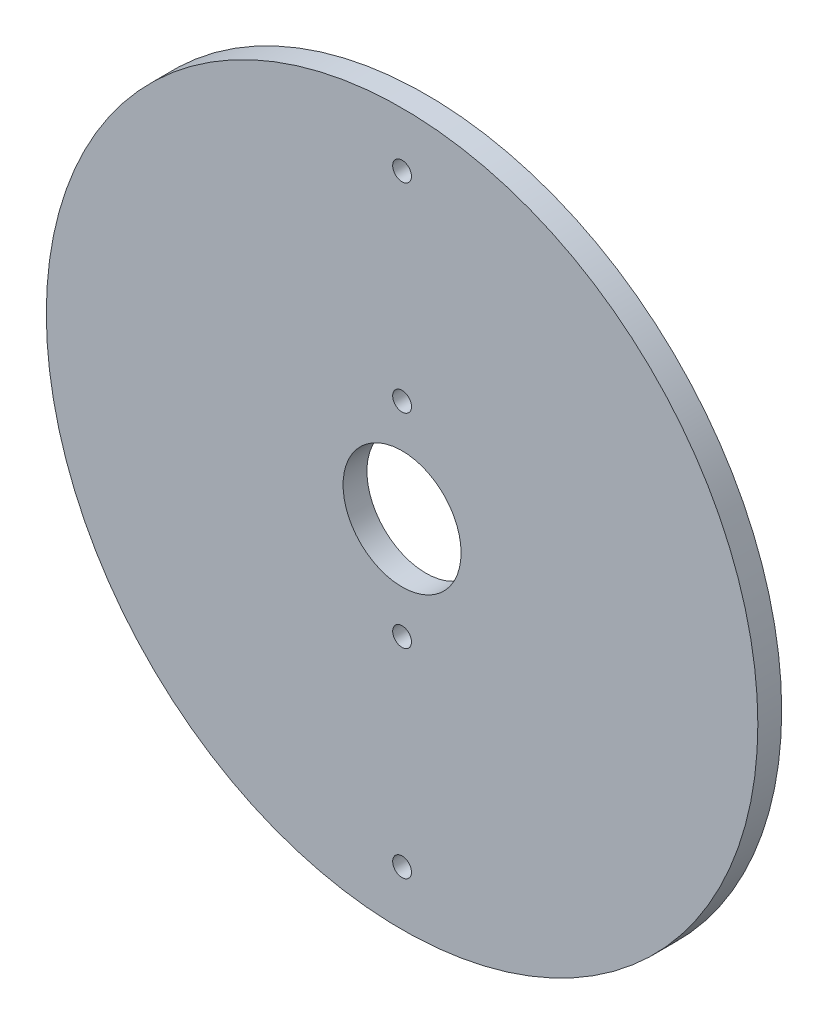
ISO-10303-21;
HEADER;
FILE_DESCRIPTION(('STEP AP214'),'2;1');
FILE_NAME('part.step','',(''),(''),'','','');
FILE_SCHEMA(('AUTOMOTIVE_DESIGN { 1 0 10303 214 1 1 1 1 }'));
ENDSEC;
DATA;
#1=APPLICATION_CONTEXT('core data for automotive mechanical design processes');
#2=APPLICATION_PROTOCOL_DEFINITION('international standard','automotive_design',2000,#1);
#3=PRODUCT_CONTEXT('',#1,'mechanical');
#4=PRODUCT('Part','Part','',(#3));
#5=PRODUCT_RELATED_PRODUCT_CATEGORY('part','',(#4));
#6=PRODUCT_DEFINITION_FORMATION('','',#4);
#7=PRODUCT_DEFINITION_CONTEXT('part definition',#1,'design');
#8=PRODUCT_DEFINITION('design','',#6,#7);
#9=PRODUCT_DEFINITION_SHAPE('','',#8);
#10=(LENGTH_UNIT() NAMED_UNIT(*) SI_UNIT(.MILLI.,.METRE.));
#11=(NAMED_UNIT(*) PLANE_ANGLE_UNIT() SI_UNIT($,.RADIAN.));
#12=(NAMED_UNIT(*) SI_UNIT($,.STERADIAN.) SOLID_ANGLE_UNIT());
#13=UNCERTAINTY_MEASURE_WITH_UNIT(LENGTH_MEASURE(1.E-05),#10,'distance_accuracy_value','');
#14=(GEOMETRIC_REPRESENTATION_CONTEXT(3) GLOBAL_UNCERTAINTY_ASSIGNED_CONTEXT((#13)) GLOBAL_UNIT_ASSIGNED_CONTEXT((#10,
#11,#12)) REPRESENTATION_CONTEXT('',''));
#15=CARTESIAN_POINT('',(0.,0.,0.));
#16=DIRECTION('',(0.,0.,1.));
#17=DIRECTION('',(1.,0.,0.));
#18=AXIS2_PLACEMENT_3D('',#15,#16,#17);
#19=CARTESIAN_POINT('',(0.,0.,4.445));
#20=DIRECTION('',(0.,0.,1.));
#21=DIRECTION('',(1.,0.,0.));
#22=AXIS2_PLACEMENT_3D('',#19,#20,#21);
#23=PLANE('',#22);
#24=CARTESIAN_POINT('',(0.,56.159019,4.445));
#25=DIRECTION('',(0.,0.,1.));
#26=DIRECTION('',(1.,0.,0.));
#27=AXIS2_PLACEMENT_3D('',#24,#25,#26);
#28=CIRCLE('',#27,1.7526);
#29=CARTESIAN_POINT('',(1.75259999999998,56.159019,4.445));
#30=VERTEX_POINT('',#29);
#31=EDGE_CURVE('E61',#30,#30,#28,.T.);
#32=ORIENTED_EDGE('',*,*,#31,.F.);
#33=EDGE_LOOP('',(#32));
#34=FACE_BOUND('',#33,.T.);
#35=CARTESIAN_POINT('',(0.,0.,4.445));
#36=DIRECTION('',(0.,0.,1.));
#37=DIRECTION('',(1.,0.,0.));
#38=AXIS2_PLACEMENT_3D('',#35,#36,#37);
#39=CIRCLE('',#38,10.9982);
#40=CARTESIAN_POINT('',(10.9982,0.,4.445));
#41=VERTEX_POINT('',#40);
#42=EDGE_CURVE('E49',#41,#41,#39,.T.);
#43=ORIENTED_EDGE('',*,*,#42,.F.);
#44=EDGE_LOOP('',(#43));
#45=FACE_BOUND('',#44,.T.);
#46=CARTESIAN_POINT('',(0.,0.,4.445));
#47=DIRECTION('',(0.,0.,1.));
#48=DIRECTION('',(1.,0.,0.));
#49=AXIS2_PLACEMENT_3D('',#46,#47,#48);
#50=CIRCLE('',#49,66.319019);
#51=CARTESIAN_POINT('',(66.319019,0.,4.445));
#52=VERTEX_POINT('',#51);
#53=EDGE_CURVE('E10',#52,#52,#50,.T.);
#54=ORIENTED_EDGE('',*,*,#53,.T.);
#55=EDGE_LOOP('',(#54));
#56=FACE_BOUND('',#55,.T.);
#57=CARTESIAN_POINT('',(0.,18.9992,4.445));
#58=DIRECTION('',(0.,0.,1.));
#59=DIRECTION('',(1.,0.,0.));
#60=AXIS2_PLACEMENT_3D('',#57,#58,#59);
#61=CIRCLE('',#60,1.7526);
#62=CARTESIAN_POINT('',(1.7526,18.9992,4.445));
#63=VERTEX_POINT('',#62);
#64=EDGE_CURVE('E44',#63,#63,#61,.T.);
#65=ORIENTED_EDGE('',*,*,#64,.F.);
#66=EDGE_LOOP('',(#65));
#67=FACE_BOUND('',#66,.T.);
#68=CARTESIAN_POINT('',(0.,-18.9992,4.445));
#69=DIRECTION('',(0.,0.,1.));
#70=DIRECTION('',(1.,0.,0.));
#71=AXIS2_PLACEMENT_3D('',#68,#69,#70);
#72=CIRCLE('',#71,1.7526);
#73=CARTESIAN_POINT('',(1.7526,-18.9992,4.445));
#74=VERTEX_POINT('',#73);
#75=EDGE_CURVE('E55',#74,#74,#72,.T.);
#76=ORIENTED_EDGE('',*,*,#75,.F.);
#77=EDGE_LOOP('',(#76));
#78=FACE_BOUND('',#77,.T.);
#79=CARTESIAN_POINT('',(0.,-56.159019,4.445));
#80=DIRECTION('',(0.,0.,1.));
#81=DIRECTION('',(1.,0.,0.));
#82=AXIS2_PLACEMENT_3D('',#79,#80,#81);
#83=CIRCLE('',#82,1.7526);
#84=CARTESIAN_POINT('',(1.75260000000001,-56.159019,4.445));
#85=VERTEX_POINT('',#84);
#86=EDGE_CURVE('E67',#85,#85,#83,.T.);
#87=ORIENTED_EDGE('',*,*,#86,.F.);
#88=EDGE_LOOP('',(#87));
#89=FACE_BOUND('',#88,.T.);
#90=ADVANCED_FACE('F33',(#34,#45,#56,#67,#78,#89),#23,.T.);
#91=CARTESIAN_POINT('',(0.,0.,0.));
#92=DIRECTION('',(0.,0.,1.));
#93=DIRECTION('',(1.,0.,0.));
#94=AXIS2_PLACEMENT_3D('',#91,#92,#93);
#95=PLANE('',#94);
#96=CARTESIAN_POINT('',(0.,56.159019,0.));
#97=DIRECTION('',(0.,0.,1.));
#98=DIRECTION('',(1.,0.,0.));
#99=AXIS2_PLACEMENT_3D('',#96,#97,#98);
#100=CIRCLE('',#99,1.7526);
#101=CARTESIAN_POINT('',(1.75259999999998,56.159019,0.));
#102=VERTEX_POINT('',#101);
#103=EDGE_CURVE('E64',#102,#102,#100,.T.);
#104=ORIENTED_EDGE('',*,*,#103,.T.);
#105=EDGE_LOOP('',(#104));
#106=FACE_BOUND('',#105,.T.);
#107=CARTESIAN_POINT('',(0.,0.,0.));
#108=DIRECTION('',(0.,0.,1.));
#109=DIRECTION('',(1.,0.,0.));
#110=AXIS2_PLACEMENT_3D('',#107,#108,#109);
#111=CIRCLE('',#110,10.9982);
#112=CARTESIAN_POINT('',(10.9982,0.,0.));
#113=VERTEX_POINT('',#112);
#114=EDGE_CURVE('E52',#113,#113,#111,.T.);
#115=ORIENTED_EDGE('',*,*,#114,.T.);
#116=EDGE_LOOP('',(#115));
#117=FACE_BOUND('',#116,.T.);
#118=CARTESIAN_POINT('',(0.,0.,0.));
#119=DIRECTION('',(0.,0.,1.));
#120=DIRECTION('',(1.,0.,0.));
#121=AXIS2_PLACEMENT_3D('',#118,#119,#120);
#122=CIRCLE('',#121,66.319019);
#123=CARTESIAN_POINT('',(66.319019,0.,0.));
#124=VERTEX_POINT('',#123);
#125=EDGE_CURVE('E37',#124,#124,#122,.T.);
#126=ORIENTED_EDGE('',*,*,#125,.F.);
#127=EDGE_LOOP('',(#126));
#128=FACE_BOUND('',#127,.T.);
#129=CARTESIAN_POINT('',(0.,18.9992,0.));
#130=DIRECTION('',(0.,0.,1.));
#131=DIRECTION('',(1.,0.,0.));
#132=AXIS2_PLACEMENT_3D('',#129,#130,#131);
#133=CIRCLE('',#132,1.7526);
#134=CARTESIAN_POINT('',(1.7526,18.9992,0.));
#135=VERTEX_POINT('',#134);
#136=EDGE_CURVE('E46',#135,#135,#133,.T.);
#137=ORIENTED_EDGE('',*,*,#136,.T.);
#138=EDGE_LOOP('',(#137));
#139=FACE_BOUND('',#138,.T.);
#140=CARTESIAN_POINT('',(0.,-18.9992,0.));
#141=DIRECTION('',(0.,0.,1.));
#142=DIRECTION('',(1.,0.,0.));
#143=AXIS2_PLACEMENT_3D('',#140,#141,#142);
#144=CIRCLE('',#143,1.7526);
#145=CARTESIAN_POINT('',(1.7526,-18.9992,0.));
#146=VERTEX_POINT('',#145);
#147=EDGE_CURVE('E58',#146,#146,#144,.T.);
#148=ORIENTED_EDGE('',*,*,#147,.T.);
#149=EDGE_LOOP('',(#148));
#150=FACE_BOUND('',#149,.T.);
#151=CARTESIAN_POINT('',(0.,-56.159019,0.));
#152=DIRECTION('',(0.,0.,1.));
#153=DIRECTION('',(1.,0.,0.));
#154=AXIS2_PLACEMENT_3D('',#151,#152,#153);
#155=CIRCLE('',#154,1.7526);
#156=CARTESIAN_POINT('',(1.75260000000001,-56.159019,0.));
#157=VERTEX_POINT('',#156);
#158=EDGE_CURVE('E70',#157,#157,#155,.T.);
#159=ORIENTED_EDGE('',*,*,#158,.T.);
#160=EDGE_LOOP('',(#159));
#161=FACE_BOUND('',#160,.T.);
#162=ADVANCED_FACE('F80',(#106,#117,#128,#139,#150,#161),#95,.F.);
#163=CARTESIAN_POINT('',(0.,0.,4.445));
#164=DIRECTION('',(0.,0.,-1.));
#165=DIRECTION('',(-1.,0.,0.));
#166=AXIS2_PLACEMENT_3D('',#163,#164,#165);
#167=CYLINDRICAL_SURFACE('',#166,66.319019);
#168=ORIENTED_EDGE('',*,*,#53,.F.);
#169=EDGE_LOOP('',(#168));
#170=FACE_BOUND('',#169,.T.);
#171=ORIENTED_EDGE('',*,*,#125,.T.);
#172=EDGE_LOOP('',(#171));
#173=FACE_BOUND('',#172,.T.);
#174=ADVANCED_FACE('F35',(#170,#173),#167,.T.);
#175=CARTESIAN_POINT('',(0.,18.9992,4.445));
#176=DIRECTION('',(0.,0.,-1.));
#177=DIRECTION('',(-1.,0.,0.));
#178=AXIS2_PLACEMENT_3D('',#175,#176,#177);
#179=CYLINDRICAL_SURFACE('',#178,1.7526);
#180=ORIENTED_EDGE('',*,*,#64,.T.);
#181=EDGE_LOOP('',(#180));
#182=FACE_BOUND('',#181,.T.);
#183=ORIENTED_EDGE('',*,*,#136,.F.);
#184=EDGE_LOOP('',(#183));
#185=FACE_BOUND('',#184,.T.);
#186=ADVANCED_FACE('F90',(#182,#185),#179,.F.);
#187=CARTESIAN_POINT('',(0.,0.,4.445));
#188=DIRECTION('',(0.,0.,-1.));
#189=DIRECTION('',(-1.,0.,0.));
#190=AXIS2_PLACEMENT_3D('',#187,#188,#189);
#191=CYLINDRICAL_SURFACE('',#190,10.9982);
#192=ORIENTED_EDGE('',*,*,#42,.T.);
#193=EDGE_LOOP('',(#192));
#194=FACE_BOUND('',#193,.T.);
#195=ORIENTED_EDGE('',*,*,#114,.F.);
#196=EDGE_LOOP('',(#195));
#197=FACE_BOUND('',#196,.T.);
#198=ADVANCED_FACE('F93',(#194,#197),#191,.F.);
#199=CARTESIAN_POINT('',(0.,-18.9992,4.445));
#200=DIRECTION('',(0.,0.,-1.));
#201=DIRECTION('',(-1.,0.,0.));
#202=AXIS2_PLACEMENT_3D('',#199,#200,#201);
#203=CYLINDRICAL_SURFACE('',#202,1.7526);
#204=ORIENTED_EDGE('',*,*,#75,.T.);
#205=EDGE_LOOP('',(#204));
#206=FACE_BOUND('',#205,.T.);
#207=ORIENTED_EDGE('',*,*,#147,.F.);
#208=EDGE_LOOP('',(#207));
#209=FACE_BOUND('',#208,.T.);
#210=ADVANCED_FACE('F97',(#206,#209),#203,.F.);
#211=CARTESIAN_POINT('',(0.,56.159019,4.445));
#212=DIRECTION('',(0.,0.,-1.));
#213=DIRECTION('',(-1.,0.,0.));
#214=AXIS2_PLACEMENT_3D('',#211,#212,#213);
#215=CYLINDRICAL_SURFACE('',#214,1.7526);
#216=ORIENTED_EDGE('',*,*,#31,.T.);
#217=EDGE_LOOP('',(#216));
#218=FACE_BOUND('',#217,.T.);
#219=ORIENTED_EDGE('',*,*,#103,.F.);
#220=EDGE_LOOP('',(#219));
#221=FACE_BOUND('',#220,.T.);
#222=ADVANCED_FACE('F101',(#218,#221),#215,.F.);
#223=CARTESIAN_POINT('',(0.,-56.159019,4.445));
#224=DIRECTION('',(0.,0.,-1.));
#225=DIRECTION('',(-1.,0.,0.));
#226=AXIS2_PLACEMENT_3D('',#223,#224,#225);
#227=CYLINDRICAL_SURFACE('',#226,1.7526);
#228=ORIENTED_EDGE('',*,*,#86,.T.);
#229=EDGE_LOOP('',(#228));
#230=FACE_BOUND('',#229,.T.);
#231=ORIENTED_EDGE('',*,*,#158,.F.);
#232=EDGE_LOOP('',(#231));
#233=FACE_BOUND('',#232,.T.);
#234=ADVANCED_FACE('F76',(#230,#233),#227,.F.);
#235=CLOSED_SHELL('',(#90,#162,#174,#186,#198,#210,#222,#234));
#236=MANIFOLD_SOLID_BREP('B2',#235);
#237=ADVANCED_BREP_SHAPE_REPRESENTATION('',(#18,#236),#14);
#238=SHAPE_DEFINITION_REPRESENTATION(#9,#237);
ENDSEC;
END-ISO-10303-21;
